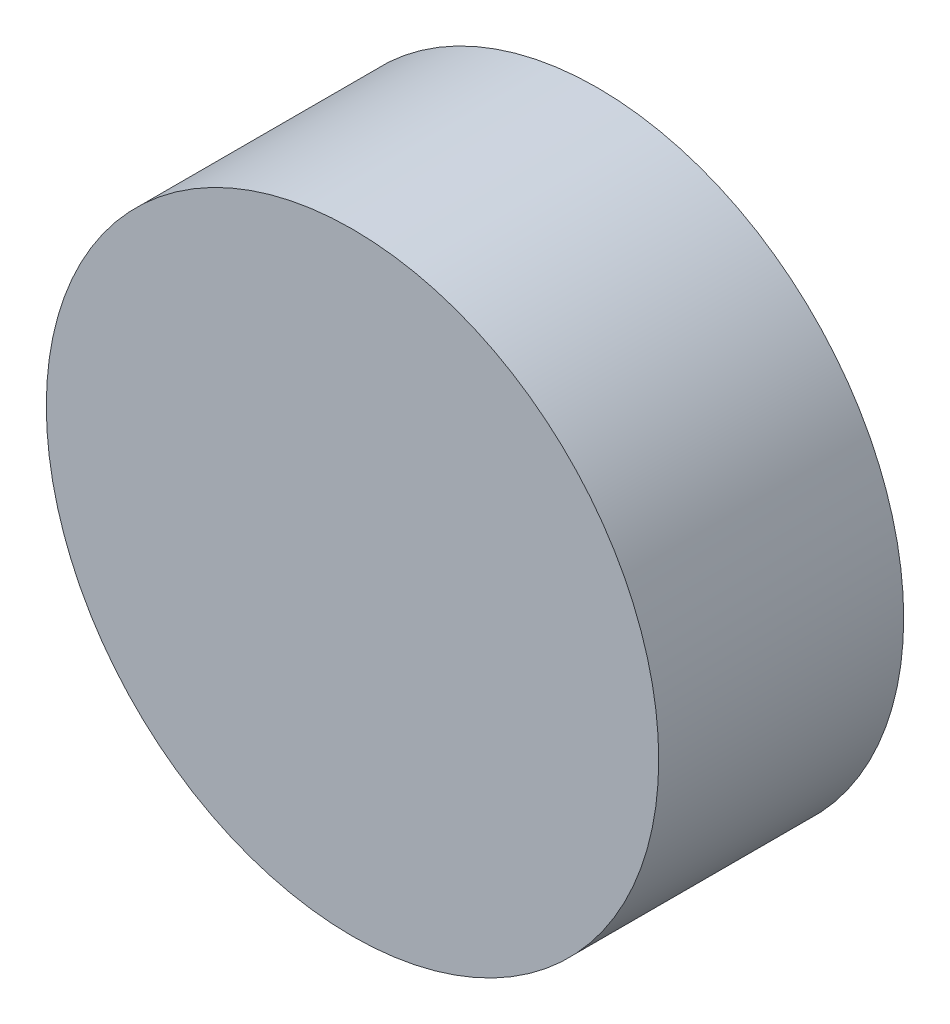
ISO-10303-21;
HEADER;
FILE_DESCRIPTION(('STEP AP214'),'2;1');
FILE_NAME('part.step','',(''),(''),'','','');
FILE_SCHEMA(('AUTOMOTIVE_DESIGN { 1 0 10303 214 1 1 1 1 }'));
ENDSEC;
DATA;
#1=APPLICATION_CONTEXT('core data for automotive mechanical design processes');
#2=APPLICATION_PROTOCOL_DEFINITION('international standard','automotive_design',2000,#1);
#3=PRODUCT_CONTEXT('',#1,'mechanical');
#4=PRODUCT('Part','Part','',(#3));
#5=PRODUCT_RELATED_PRODUCT_CATEGORY('part','',(#4));
#6=PRODUCT_DEFINITION_FORMATION('','',#4);
#7=PRODUCT_DEFINITION_CONTEXT('part definition',#1,'design');
#8=PRODUCT_DEFINITION('design','',#6,#7);
#9=PRODUCT_DEFINITION_SHAPE('','',#8);
#10=(LENGTH_UNIT() NAMED_UNIT(*) SI_UNIT(.MILLI.,.METRE.));
#11=(NAMED_UNIT(*) PLANE_ANGLE_UNIT() SI_UNIT($,.RADIAN.));
#12=(NAMED_UNIT(*) SI_UNIT($,.STERADIAN.) SOLID_ANGLE_UNIT());
#13=UNCERTAINTY_MEASURE_WITH_UNIT(LENGTH_MEASURE(1.E-05),#10,'distance_accuracy_value','');
#14=(GEOMETRIC_REPRESENTATION_CONTEXT(3) GLOBAL_UNCERTAINTY_ASSIGNED_CONTEXT((#13)) GLOBAL_UNIT_ASSIGNED_CONTEXT((#10,
#11,#12)) REPRESENTATION_CONTEXT('',''));
#15=CARTESIAN_POINT('',(0.,0.,0.));
#16=DIRECTION('',(0.,0.,1.));
#17=DIRECTION('',(1.,0.,0.));
#18=AXIS2_PLACEMENT_3D('',#15,#16,#17);
#19=CARTESIAN_POINT('',(0.,0.,2.));
#20=DIRECTION('',(0.,0.,-1.));
#21=DIRECTION('',(-1.,0.,0.));
#22=AXIS2_PLACEMENT_3D('',#19,#20,#21);
#23=CYLINDRICAL_SURFACE('',#22,2.5);
#24=CARTESIAN_POINT('',(0.,0.,2.));
#25=DIRECTION('',(0.,0.,1.));
#26=DIRECTION('',(1.,0.,0.));
#27=AXIS2_PLACEMENT_3D('',#24,#25,#26);
#28=CIRCLE('',#27,2.5);
#29=CARTESIAN_POINT('',(2.5,0.,2.));
#30=VERTEX_POINT('',#29);
#31=EDGE_CURVE('E10',#30,#30,#28,.T.);
#32=ORIENTED_EDGE('',*,*,#31,.F.);
#33=EDGE_LOOP('',(#32));
#34=FACE_BOUND('',#33,.T.);
#35=CARTESIAN_POINT('',(0.,0.,0.));
#36=DIRECTION('',(0.,0.,1.));
#37=DIRECTION('',(1.,0.,0.));
#38=AXIS2_PLACEMENT_3D('',#35,#36,#37);
#39=CIRCLE('',#38,2.5);
#40=CARTESIAN_POINT('',(2.5,0.,0.));
#41=VERTEX_POINT('',#40);
#42=EDGE_CURVE('E41',#41,#41,#39,.T.);
#43=ORIENTED_EDGE('',*,*,#42,.T.);
#44=EDGE_LOOP('',(#43));
#45=FACE_BOUND('',#44,.T.);
#46=ADVANCED_FACE('F36',(#34,#45),#23,.T.);
#47=CARTESIAN_POINT('',(0.,0.,2.));
#48=DIRECTION('',(0.,0.,1.));
#49=DIRECTION('',(1.,0.,0.));
#50=AXIS2_PLACEMENT_3D('',#47,#48,#49);
#51=PLANE('',#50);
#52=ORIENTED_EDGE('',*,*,#31,.T.);
#53=EDGE_LOOP('',(#52));
#54=FACE_BOUND('',#53,.T.);
#55=ADVANCED_FACE('F52',(#54),#51,.T.);
#56=CARTESIAN_POINT('',(0.,0.,0.));
#57=DIRECTION('',(0.,0.,1.));
#58=DIRECTION('',(1.,0.,0.));
#59=AXIS2_PLACEMENT_3D('',#56,#57,#58);
#60=PLANE('',#59);
#61=ORIENTED_EDGE('',*,*,#42,.F.);
#62=EDGE_LOOP('',(#61));
#63=FACE_BOUND('',#62,.T.);
#64=ADVANCED_FACE('F51',(#63),#60,.F.);
#65=CLOSED_SHELL('',(#46,#55,#64));
#66=MANIFOLD_SOLID_BREP('B2',#65);
#67=ADVANCED_BREP_SHAPE_REPRESENTATION('',(#18,#66),#14);
#68=SHAPE_DEFINITION_REPRESENTATION(#9,#67);
ENDSEC;
END-ISO-10303-21;
